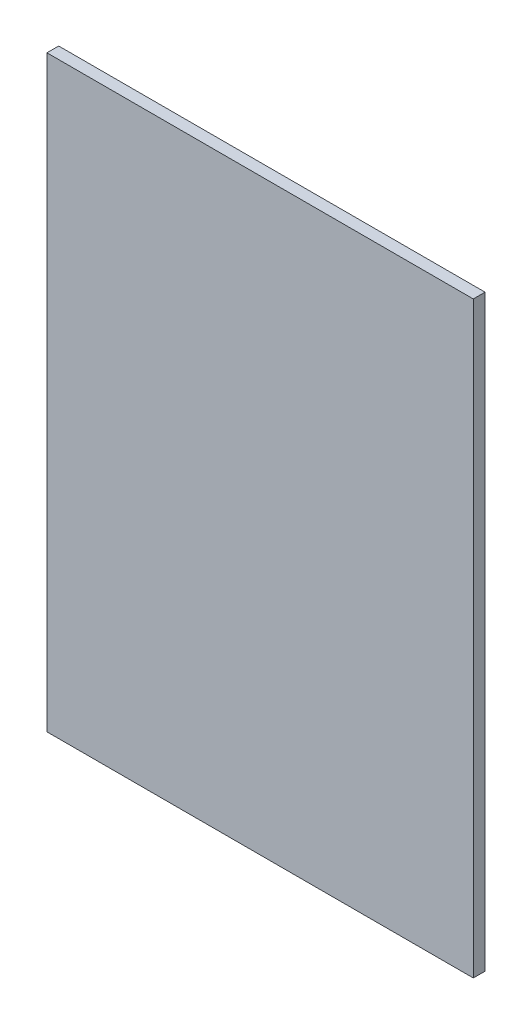
ISO-10303-21;
HEADER;
FILE_DESCRIPTION(('STEP AP214'),'2;1');
FILE_NAME('part.step','',(''),(''),'','','');
FILE_SCHEMA(('AUTOMOTIVE_DESIGN { 1 0 10303 214 1 1 1 1 }'));
ENDSEC;
DATA;
#1=APPLICATION_CONTEXT('core data for automotive mechanical design processes');
#2=APPLICATION_PROTOCOL_DEFINITION('international standard','automotive_design',2000,#1);
#3=PRODUCT_CONTEXT('',#1,'mechanical');
#4=PRODUCT('Part','Part','',(#3));
#5=PRODUCT_RELATED_PRODUCT_CATEGORY('part','',(#4));
#6=PRODUCT_DEFINITION_FORMATION('','',#4);
#7=PRODUCT_DEFINITION_CONTEXT('part definition',#1,'design');
#8=PRODUCT_DEFINITION('design','',#6,#7);
#9=PRODUCT_DEFINITION_SHAPE('','',#8);
#10=(LENGTH_UNIT() NAMED_UNIT(*) SI_UNIT(.MILLI.,.METRE.));
#11=(NAMED_UNIT(*) PLANE_ANGLE_UNIT() SI_UNIT($,.RADIAN.));
#12=(NAMED_UNIT(*) SI_UNIT($,.STERADIAN.) SOLID_ANGLE_UNIT());
#13=UNCERTAINTY_MEASURE_WITH_UNIT(LENGTH_MEASURE(1.E-05),#10,'distance_accuracy_value','');
#14=(GEOMETRIC_REPRESENTATION_CONTEXT(3) GLOBAL_UNCERTAINTY_ASSIGNED_CONTEXT((#13)) GLOBAL_UNIT_ASSIGNED_CONTEXT((#10,
#11,#12)) REPRESENTATION_CONTEXT('',''));
#15=CARTESIAN_POINT('',(0.,0.,0.));
#16=DIRECTION('',(0.,0.,1.));
#17=DIRECTION('',(1.,0.,0.));
#18=AXIS2_PLACEMENT_3D('',#15,#16,#17);
#19=CARTESIAN_POINT('',(0.,0.,-129.516));
#20=DIRECTION('',(0.,0.,1.));
#21=DIRECTION('',(1.,0.,0.));
#22=AXIS2_PLACEMENT_3D('',#19,#20,#21);
#23=PLANE('',#22);
#24=DIRECTION('',(1.,0.,0.));
#25=VECTOR('',#24,1.);
#26=CARTESIAN_POINT('',(-64.1448312591708,-43.3075901688552,-129.516));
#27=LINE('',#26,#25);
#28=CARTESIAN_POINT('',(-122.144831259171,-43.3075901688552,-129.516));
#29=VERTEX_POINT('',#28);
#30=CARTESIAN_POINT('',(-64.1448312591708,-43.3075901688552,-129.516));
#31=VERTEX_POINT('',#30);
#32=EDGE_CURVE('E79',#29,#31,#27,.T.);
#33=ORIENTED_EDGE('',*,*,#32,.F.);
#34=DIRECTION('',(0.,1.,0.));
#35=VECTOR('',#34,1.);
#36=CARTESIAN_POINT('',(-122.144831259171,-43.3075901688552,-129.516));
#37=LINE('',#36,#35);
#38=CARTESIAN_POINT('',(-122.144831259171,36.6924098311448,-129.516));
#39=VERTEX_POINT('',#38);
#40=EDGE_CURVE('E55',#39,#29,#37,.F.);
#41=ORIENTED_EDGE('',*,*,#40,.F.);
#42=DIRECTION('',(1.,0.,0.));
#43=VECTOR('',#42,1.);
#44=CARTESIAN_POINT('',(-64.1448312591708,36.6924098311448,-129.516));
#45=LINE('',#44,#43);
#46=CARTESIAN_POINT('',(-64.1448312591708,36.6924098311448,-129.516));
#47=VERTEX_POINT('',#46);
#48=EDGE_CURVE('E67',#39,#47,#45,.T.);
#49=ORIENTED_EDGE('',*,*,#48,.T.);
#50=DIRECTION('',(0.,1.,0.));
#51=VECTOR('',#50,1.);
#52=CARTESIAN_POINT('',(-64.1448312591708,-43.3075901688552,-129.516));
#53=LINE('',#52,#51);
#54=EDGE_CURVE('E20',#47,#31,#53,.F.);
#55=ORIENTED_EDGE('',*,*,#54,.T.);
#56=EDGE_LOOP('',(#33,#41,#49,#55));
#57=FACE_BOUND('',#56,.T.);
#58=ADVANCED_FACE('F17',(#57),#23,.F.);
#59=CARTESIAN_POINT('',(-64.1448312591708,-43.3075901688552,-127.916));
#60=DIRECTION('',(-1.,0.,0.));
#61=DIRECTION('',(0.,0.,1.));
#62=AXIS2_PLACEMENT_3D('',#59,#60,#61);
#63=PLANE('',#62);
#64=DIRECTION('',(0.,0.,1.));
#65=VECTOR('',#64,1.);
#66=CARTESIAN_POINT('',(-64.1448312591708,36.6924098311448,-127.916));
#67=LINE('',#66,#65);
#68=CARTESIAN_POINT('',(-64.1448312591708,36.6924098311448,-127.916));
#69=VERTEX_POINT('',#68);
#70=EDGE_CURVE('E62',#47,#69,#67,.T.);
#71=ORIENTED_EDGE('',*,*,#70,.T.);
#72=DIRECTION('',(0.,1.,0.));
#73=VECTOR('',#72,1.);
#74=CARTESIAN_POINT('',(-64.1448312591708,0.,-127.916));
#75=LINE('',#74,#73);
#76=CARTESIAN_POINT('',(-64.1448312591708,-43.3075901688552,-127.916));
#77=VERTEX_POINT('',#76);
#78=EDGE_CURVE('E83',#77,#69,#75,.T.);
#79=ORIENTED_EDGE('',*,*,#78,.F.);
#80=DIRECTION('',(0.,0.,1.));
#81=VECTOR('',#80,1.);
#82=CARTESIAN_POINT('',(-64.1448312591708,-43.3075901688552,-127.916));
#83=LINE('',#82,#81);
#84=EDGE_CURVE('E65',#31,#77,#83,.T.);
#85=ORIENTED_EDGE('',*,*,#84,.F.);
#86=ORIENTED_EDGE('',*,*,#54,.F.);
#87=EDGE_LOOP('',(#71,#79,#85,#86));
#88=FACE_BOUND('',#87,.T.);
#89=ADVANCED_FACE('F60',(#88),#63,.F.);
#90=CARTESIAN_POINT('',(-64.1448312591708,36.6924098311448,-127.916));
#91=DIRECTION('',(0.,-1.,0.));
#92=DIRECTION('',(1.,0.,0.));
#93=AXIS2_PLACEMENT_3D('',#90,#91,#92);
#94=PLANE('',#93);
#95=DIRECTION('',(0.,0.,1.));
#96=VECTOR('',#95,1.);
#97=CARTESIAN_POINT('',(-122.144831259171,36.6924098311448,-127.916));
#98=LINE('',#97,#96);
#99=CARTESIAN_POINT('',(-122.144831259171,36.6924098311448,-127.916));
#100=VERTEX_POINT('',#99);
#101=EDGE_CURVE('E77',#100,#39,#98,.F.);
#102=ORIENTED_EDGE('',*,*,#101,.F.);
#103=DIRECTION('',(1.,0.,0.));
#104=VECTOR('',#103,1.);
#105=CARTESIAN_POINT('',(0.,36.6924098311448,-127.916));
#106=LINE('',#105,#104);
#107=EDGE_CURVE('E73',#69,#100,#106,.F.);
#108=ORIENTED_EDGE('',*,*,#107,.F.);
#109=ORIENTED_EDGE('',*,*,#70,.F.);
#110=ORIENTED_EDGE('',*,*,#48,.F.);
#111=EDGE_LOOP('',(#102,#108,#109,#110));
#112=FACE_BOUND('',#111,.T.);
#113=ADVANCED_FACE('F71',(#112),#94,.F.);
#114=CARTESIAN_POINT('',(-122.144831259171,-43.3075901688552,-127.916));
#115=DIRECTION('',(-1.,0.,0.));
#116=DIRECTION('',(0.,0.,1.));
#117=AXIS2_PLACEMENT_3D('',#114,#115,#116);
#118=PLANE('',#117);
#119=DIRECTION('',(0.,1.,0.));
#120=VECTOR('',#119,1.);
#121=CARTESIAN_POINT('',(-122.144831259171,0.,-127.916));
#122=LINE('',#121,#120);
#123=CARTESIAN_POINT('',(-122.144831259171,-43.3075901688552,-127.916));
#124=VERTEX_POINT('',#123);
#125=EDGE_CURVE('E26',#100,#124,#122,.F.);
#126=ORIENTED_EDGE('',*,*,#125,.F.);
#127=ORIENTED_EDGE('',*,*,#101,.T.);
#128=ORIENTED_EDGE('',*,*,#40,.T.);
#129=DIRECTION('',(0.,0.,1.));
#130=VECTOR('',#129,1.);
#131=CARTESIAN_POINT('',(-122.144831259171,-43.3075901688552,-127.916));
#132=LINE('',#131,#130);
#133=EDGE_CURVE('E35',#124,#29,#132,.F.);
#134=ORIENTED_EDGE('',*,*,#133,.F.);
#135=EDGE_LOOP('',(#126,#127,#128,#134));
#136=FACE_BOUND('',#135,.T.);
#137=ADVANCED_FACE('F89',(#136),#118,.T.);
#138=CARTESIAN_POINT('',(-64.1448312591708,-43.3075901688552,-127.916));
#139=DIRECTION('',(0.,-1.,0.));
#140=DIRECTION('',(1.,0.,0.));
#141=AXIS2_PLACEMENT_3D('',#138,#139,#140);
#142=PLANE('',#141);
#143=DIRECTION('',(1.,0.,0.));
#144=VECTOR('',#143,1.);
#145=CARTESIAN_POINT('',(0.,-43.3075901688552,-127.916));
#146=LINE('',#145,#144);
#147=EDGE_CURVE('E11',#124,#77,#146,.T.);
#148=ORIENTED_EDGE('',*,*,#147,.F.);
#149=ORIENTED_EDGE('',*,*,#133,.T.);
#150=ORIENTED_EDGE('',*,*,#32,.T.);
#151=ORIENTED_EDGE('',*,*,#84,.T.);
#152=EDGE_LOOP('',(#148,#149,#150,#151));
#153=FACE_BOUND('',#152,.T.);
#154=ADVANCED_FACE('F91',(#153),#142,.T.);
#155=CARTESIAN_POINT('',(0.,0.,-127.916));
#156=DIRECTION('',(0.,0.,1.));
#157=DIRECTION('',(1.,0.,0.));
#158=AXIS2_PLACEMENT_3D('',#155,#156,#157);
#159=PLANE('',#158);
#160=ORIENTED_EDGE('',*,*,#125,.T.);
#161=ORIENTED_EDGE('',*,*,#147,.T.);
#162=ORIENTED_EDGE('',*,*,#78,.T.);
#163=ORIENTED_EDGE('',*,*,#107,.T.);
#164=EDGE_LOOP('',(#160,#161,#162,#163));
#165=FACE_BOUND('',#164,.T.);
#166=ADVANCED_FACE('F88',(#165),#159,.T.);
#167=CLOSED_SHELL('',(#58,#89,#113,#137,#154,#166));
#168=MANIFOLD_SOLID_BREP('B1',#167);
#169=ADVANCED_BREP_SHAPE_REPRESENTATION('',(#18,#168),#14);
#170=SHAPE_DEFINITION_REPRESENTATION(#9,#169);
ENDSEC;
END-ISO-10303-21;
